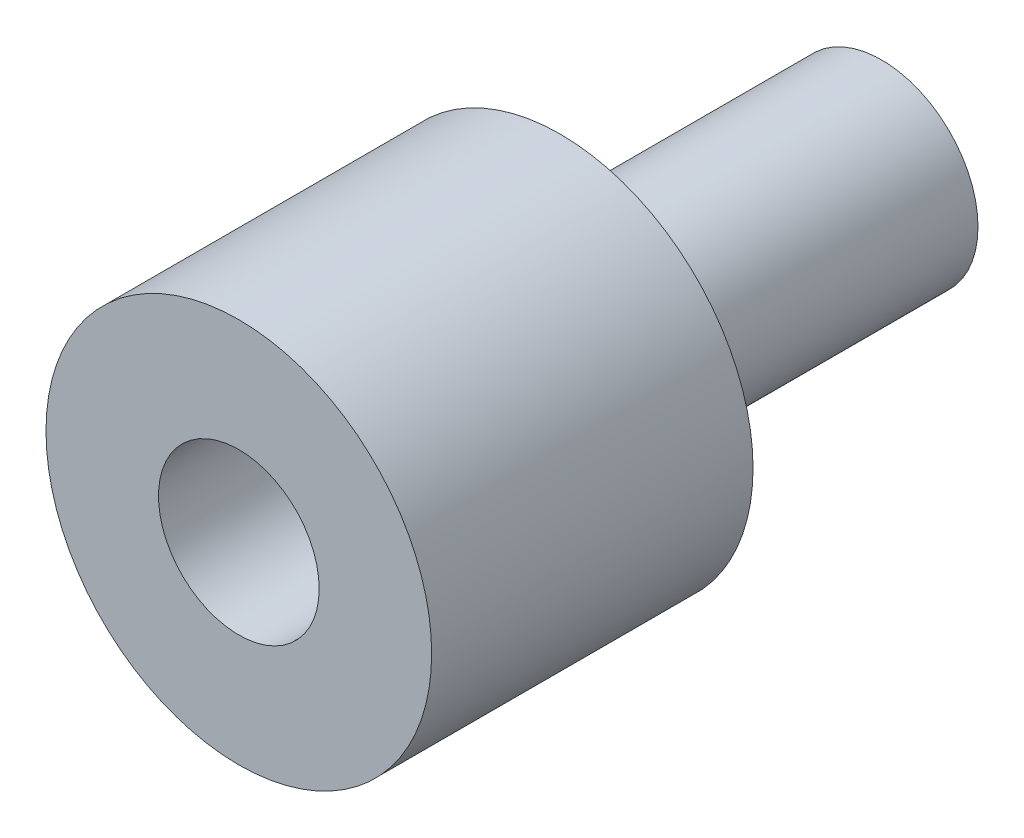
ISO-10303-21;
HEADER;
FILE_DESCRIPTION(('STEP AP214'),'2;1');
FILE_NAME('part.step','',(''),(''),'','','');
FILE_SCHEMA(('AUTOMOTIVE_DESIGN { 1 0 10303 214 1 1 1 1 }'));
ENDSEC;
DATA;
#1=APPLICATION_CONTEXT('core data for automotive mechanical design processes');
#2=APPLICATION_PROTOCOL_DEFINITION('international standard','automotive_design',2000,#1);
#3=PRODUCT_CONTEXT('',#1,'mechanical');
#4=PRODUCT('Part','Part','',(#3));
#5=PRODUCT_RELATED_PRODUCT_CATEGORY('part','',(#4));
#6=PRODUCT_DEFINITION_FORMATION('','',#4);
#7=PRODUCT_DEFINITION_CONTEXT('part definition',#1,'design');
#8=PRODUCT_DEFINITION('design','',#6,#7);
#9=PRODUCT_DEFINITION_SHAPE('','',#8);
#10=(LENGTH_UNIT() NAMED_UNIT(*) SI_UNIT(.MILLI.,.METRE.));
#11=(NAMED_UNIT(*) PLANE_ANGLE_UNIT() SI_UNIT($,.RADIAN.));
#12=(NAMED_UNIT(*) SI_UNIT($,.STERADIAN.) SOLID_ANGLE_UNIT());
#13=UNCERTAINTY_MEASURE_WITH_UNIT(LENGTH_MEASURE(1.E-05),#10,'distance_accuracy_value','');
#14=(GEOMETRIC_REPRESENTATION_CONTEXT(3) GLOBAL_UNCERTAINTY_ASSIGNED_CONTEXT((#13)) GLOBAL_UNIT_ASSIGNED_CONTEXT((#10,
#11,#12)) REPRESENTATION_CONTEXT('',''));
#15=CARTESIAN_POINT('',(0.,0.,0.));
#16=DIRECTION('',(0.,0.,1.));
#17=DIRECTION('',(1.,0.,0.));
#18=AXIS2_PLACEMENT_3D('',#15,#16,#17);
#19=CARTESIAN_POINT('',(0.,0.,20.));
#20=DIRECTION('',(0.,0.,-1.));
#21=DIRECTION('',(-1.,0.,0.));
#22=AXIS2_PLACEMENT_3D('',#19,#20,#21);
#23=CYLINDRICAL_SURFACE('',#22,12.);
#24=CARTESIAN_POINT('',(0.,0.,20.));
#25=DIRECTION('',(0.,0.,1.));
#26=DIRECTION('',(1.,0.,0.));
#27=AXIS2_PLACEMENT_3D('',#24,#25,#26);
#28=CIRCLE('',#27,12.);
#29=CARTESIAN_POINT('',(12.,0.,20.));
#30=VERTEX_POINT('',#29);
#31=EDGE_CURVE('E10',#30,#30,#28,.T.);
#32=ORIENTED_EDGE('',*,*,#31,.F.);
#33=EDGE_LOOP('',(#32));
#34=FACE_BOUND('',#33,.T.);
#35=CARTESIAN_POINT('',(0.,0.,0.));
#36=DIRECTION('',(0.,0.,1.));
#37=DIRECTION('',(1.,0.,0.));
#38=AXIS2_PLACEMENT_3D('',#35,#36,#37);
#39=CIRCLE('',#38,12.);
#40=CARTESIAN_POINT('',(12.,0.,0.));
#41=VERTEX_POINT('',#40);
#42=EDGE_CURVE('E34',#41,#41,#39,.T.);
#43=ORIENTED_EDGE('',*,*,#42,.T.);
#44=EDGE_LOOP('',(#43));
#45=FACE_BOUND('',#44,.T.);
#46=ADVANCED_FACE('F31',(#34,#45),#23,.T.);
#47=CARTESIAN_POINT('',(0.,0.,20.));
#48=DIRECTION('',(0.,0.,1.));
#49=DIRECTION('',(1.,0.,0.));
#50=AXIS2_PLACEMENT_3D('',#47,#48,#49);
#51=PLANE('',#50);
#52=CARTESIAN_POINT('',(0.,0.,20.));
#53=DIRECTION('',(0.,0.,1.));
#54=DIRECTION('',(1.,0.,0.));
#55=AXIS2_PLACEMENT_3D('',#52,#53,#54);
#56=CIRCLE('',#55,5.);
#57=CARTESIAN_POINT('',(5.,0.,20.));
#58=VERTEX_POINT('',#57);
#59=EDGE_CURVE('E49',#58,#58,#56,.T.);
#60=ORIENTED_EDGE('',*,*,#59,.F.);
#61=EDGE_LOOP('',(#60));
#62=FACE_BOUND('',#61,.T.);
#63=ORIENTED_EDGE('',*,*,#31,.T.);
#64=EDGE_LOOP('',(#63));
#65=FACE_BOUND('',#64,.T.);
#66=ADVANCED_FACE('F64',(#62,#65),#51,.T.);
#67=CARTESIAN_POINT('',(0.,0.,0.));
#68=DIRECTION('',(0.,0.,1.));
#69=DIRECTION('',(1.,0.,0.));
#70=AXIS2_PLACEMENT_3D('',#67,#68,#69);
#71=PLANE('',#70);
#72=CARTESIAN_POINT('',(0.,0.,0.));
#73=DIRECTION('',(0.,0.,1.));
#74=DIRECTION('',(1.,0.,0.));
#75=AXIS2_PLACEMENT_3D('',#72,#73,#74);
#76=CIRCLE('',#75,6.00000000000001);
#77=CARTESIAN_POINT('',(6.00000000000001,0.,0.));
#78=VERTEX_POINT('',#77);
#79=EDGE_CURVE('E43',#78,#78,#76,.T.);
#80=ORIENTED_EDGE('',*,*,#79,.T.);
#81=EDGE_LOOP('',(#80));
#82=FACE_BOUND('',#81,.T.);
#83=ORIENTED_EDGE('',*,*,#42,.F.);
#84=EDGE_LOOP('',(#83));
#85=FACE_BOUND('',#84,.T.);
#86=ADVANCED_FACE('F66',(#82,#85),#71,.F.);
#87=CARTESIAN_POINT('',(0.,0.,-20.));
#88=DIRECTION('',(0.,0.,1.));
#89=DIRECTION('',(1.,0.,0.));
#90=AXIS2_PLACEMENT_3D('',#87,#88,#89);
#91=CYLINDRICAL_SURFACE('',#90,6.00000000000001);
#92=CARTESIAN_POINT('',(0.,0.,-20.));
#93=DIRECTION('',(0.,0.,1.));
#94=DIRECTION('',(1.,0.,0.));
#95=AXIS2_PLACEMENT_3D('',#92,#93,#94);
#96=CIRCLE('',#95,6.00000000000001);
#97=CARTESIAN_POINT('',(6.00000000000001,0.,-20.));
#98=VERTEX_POINT('',#97);
#99=EDGE_CURVE('E41',#98,#98,#96,.T.);
#100=ORIENTED_EDGE('',*,*,#99,.T.);
#101=EDGE_LOOP('',(#100));
#102=FACE_BOUND('',#101,.T.);
#103=ORIENTED_EDGE('',*,*,#79,.F.);
#104=EDGE_LOOP('',(#103));
#105=FACE_BOUND('',#104,.T.);
#106=ADVANCED_FACE('F72',(#102,#105),#91,.T.);
#107=CARTESIAN_POINT('',(0.,0.,-20.));
#108=DIRECTION('',(0.,0.,1.));
#109=DIRECTION('',(1.,0.,0.));
#110=AXIS2_PLACEMENT_3D('',#107,#108,#109);
#111=PLANE('',#110);
#112=ORIENTED_EDGE('',*,*,#99,.F.);
#113=EDGE_LOOP('',(#112));
#114=FACE_BOUND('',#113,.T.);
#115=ADVANCED_FACE('F60',(#114),#111,.F.);
#116=CARTESIAN_POINT('',(0.,0.,8.));
#117=DIRECTION('',(0.,0.,1.));
#118=DIRECTION('',(1.,0.,0.));
#119=AXIS2_PLACEMENT_3D('',#116,#117,#118);
#120=CYLINDRICAL_SURFACE('',#119,5.);
#121=CARTESIAN_POINT('',(0.,0.,8.));
#122=DIRECTION('',(0.,0.,1.));
#123=DIRECTION('',(1.,0.,0.));
#124=AXIS2_PLACEMENT_3D('',#121,#122,#123);
#125=CIRCLE('',#124,5.);
#126=CARTESIAN_POINT('',(5.,0.,8.));
#127=VERTEX_POINT('',#126);
#128=EDGE_CURVE('E46',#127,#127,#125,.T.);
#129=ORIENTED_EDGE('',*,*,#128,.F.);
#130=EDGE_LOOP('',(#129));
#131=FACE_BOUND('',#130,.T.);
#132=ORIENTED_EDGE('',*,*,#59,.T.);
#133=EDGE_LOOP('',(#132));
#134=FACE_BOUND('',#133,.T.);
#135=ADVANCED_FACE('F57',(#131,#134),#120,.F.);
#136=CARTESIAN_POINT('',(0.,0.,8.));
#137=DIRECTION('',(0.,0.,1.));
#138=DIRECTION('',(1.,0.,0.));
#139=AXIS2_PLACEMENT_3D('',#136,#137,#138);
#140=PLANE('',#139);
#141=ORIENTED_EDGE('',*,*,#128,.T.);
#142=EDGE_LOOP('',(#141));
#143=FACE_BOUND('',#142,.T.);
#144=ADVANCED_FACE('F55',(#143),#140,.T.);
#145=CLOSED_SHELL('',(#46,#66,#86,#106,#115,#135,#144));
#146=MANIFOLD_SOLID_BREP('B2',#145);
#147=ADVANCED_BREP_SHAPE_REPRESENTATION('',(#18,#146),#14);
#148=SHAPE_DEFINITION_REPRESENTATION(#9,#147);
ENDSEC;
END-ISO-10303-21;
